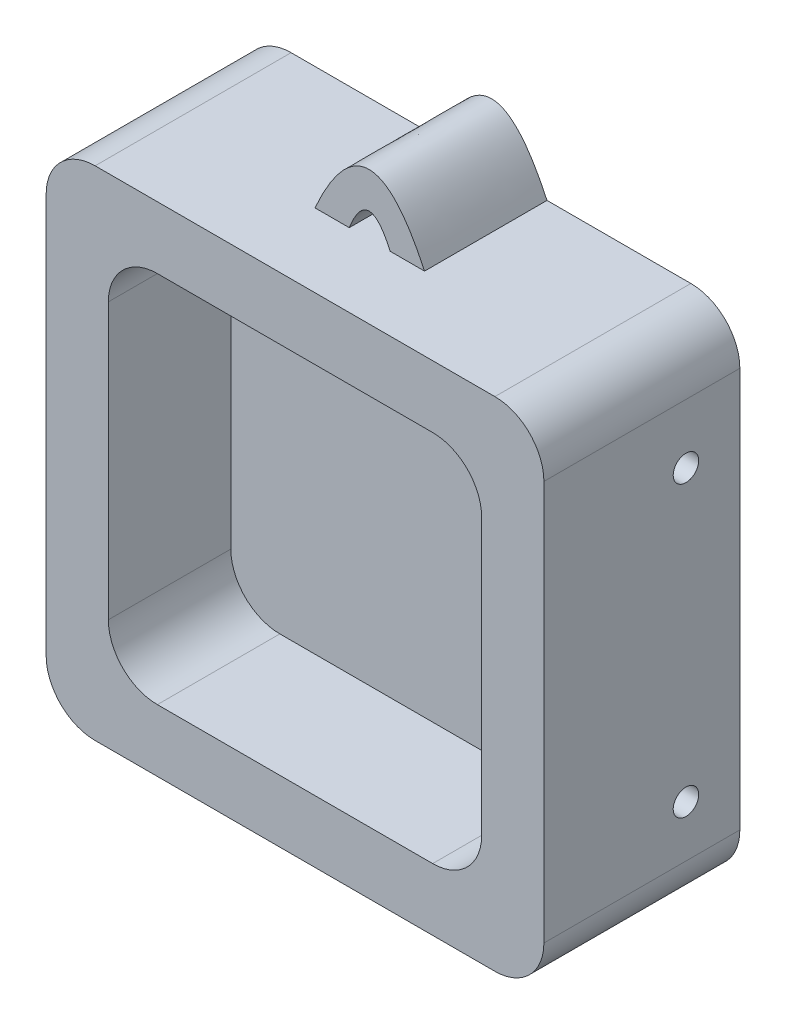
ISO-10303-21;
HEADER;
FILE_DESCRIPTION(('STEP AP214'),'2;1');
FILE_NAME('part.step','',(''),(''),'','','');
FILE_SCHEMA(('AUTOMOTIVE_DESIGN { 1 0 10303 214 1 1 1 1 }'));
ENDSEC;
DATA;
#1=APPLICATION_CONTEXT('core data for automotive mechanical design processes');
#2=APPLICATION_PROTOCOL_DEFINITION('international standard','automotive_design',2000,#1);
#3=PRODUCT_CONTEXT('',#1,'mechanical');
#4=PRODUCT('Part','Part','',(#3));
#5=PRODUCT_RELATED_PRODUCT_CATEGORY('part','',(#4));
#6=PRODUCT_DEFINITION_FORMATION('','',#4);
#7=PRODUCT_DEFINITION_CONTEXT('part definition',#1,'design');
#8=PRODUCT_DEFINITION('design','',#6,#7);
#9=PRODUCT_DEFINITION_SHAPE('','',#8);
#10=(LENGTH_UNIT() NAMED_UNIT(*) SI_UNIT(.MILLI.,.METRE.));
#11=(NAMED_UNIT(*) PLANE_ANGLE_UNIT() SI_UNIT($,.RADIAN.));
#12=(NAMED_UNIT(*) SI_UNIT($,.STERADIAN.) SOLID_ANGLE_UNIT());
#13=UNCERTAINTY_MEASURE_WITH_UNIT(LENGTH_MEASURE(1.E-05),#10,'distance_accuracy_value','');
#14=(GEOMETRIC_REPRESENTATION_CONTEXT(3) GLOBAL_UNCERTAINTY_ASSIGNED_CONTEXT((#13)) GLOBAL_UNIT_ASSIGNED_CONTEXT((#10,
#11,#12)) REPRESENTATION_CONTEXT('',''));
#15=CARTESIAN_POINT('',(0.,0.,0.));
#16=DIRECTION('',(0.,0.,1.));
#17=DIRECTION('',(1.,0.,0.));
#18=AXIS2_PLACEMENT_3D('',#15,#16,#17);
#19=CARTESIAN_POINT('',(0.,101.6,40.));
#20=DIRECTION('',(0.,1.,0.));
#21=DIRECTION('',(0.,0.,1.));
#22=AXIS2_PLACEMENT_3D('',#19,#20,#21);
#23=PLANE('',#22);
#24=DIRECTION('',(1.,0.,0.));
#25=VECTOR('',#24,1.);
#26=CARTESIAN_POINT('',(0.,101.6,40.));
#27=LINE('',#26,#25);
#28=CARTESIAN_POINT('',(9.99999999999998,101.6,40.));
#29=VERTEX_POINT('',#28);
#30=CARTESIAN_POINT('',(91.6,101.6,40.));
#31=VERTEX_POINT('',#30);
#32=EDGE_CURVE('E245',#29,#31,#27,.T.);
#33=ORIENTED_EDGE('',*,*,#32,.T.);
#34=DIRECTION('',(0.,0.,-1.));
#35=VECTOR('',#34,1.);
#36=CARTESIAN_POINT('',(91.6,101.6,0.));
#37=LINE('',#36,#35);
#38=CARTESIAN_POINT('',(91.6,101.6,0.));
#39=VERTEX_POINT('',#38);
#40=EDGE_CURVE('E319',#31,#39,#37,.T.);
#41=ORIENTED_EDGE('',*,*,#40,.T.);
#42=DIRECTION('',(1.,0.,0.));
#43=VECTOR('',#42,1.);
#44=CARTESIAN_POINT('',(0.,101.6,0.));
#45=LINE('',#44,#43);
#46=CARTESIAN_POINT('',(62.2378123331958,101.6,0.));
#47=VERTEX_POINT('',#46);
#48=EDGE_CURVE('E274',#47,#39,#45,.T.);
#49=ORIENTED_EDGE('',*,*,#48,.F.);
#50=DIRECTION('',(0.,0.,-1.));
#51=VECTOR('',#50,1.);
#52=CARTESIAN_POINT('',(62.2378123331958,101.6,25.));
#53=LINE('',#52,#51);
#54=CARTESIAN_POINT('',(62.2378123331958,101.6,25.));
#55=VERTEX_POINT('',#54);
#56=EDGE_CURVE('E221',#55,#47,#53,.T.);
#57=ORIENTED_EDGE('',*,*,#56,.F.);
#58=DIRECTION('',(1.,0.,0.));
#59=VECTOR('',#58,1.);
#60=CARTESIAN_POINT('',(0.,101.6,25.));
#61=LINE('',#60,#59);
#62=CARTESIAN_POINT('',(55.2378123331958,101.6,25.));
#63=VERTEX_POINT('',#62);
#64=EDGE_CURVE('E197',#63,#55,#61,.T.);
#65=ORIENTED_EDGE('',*,*,#64,.F.);
#66=DIRECTION('',(0.,0.,-1.));
#67=VECTOR('',#66,1.);
#68=CARTESIAN_POINT('',(55.2378123331958,101.6,25.));
#69=LINE('',#68,#67);
#70=CARTESIAN_POINT('',(55.2378123331958,101.6,0.));
#71=VERTEX_POINT('',#70);
#72=EDGE_CURVE('E193',#63,#71,#69,.T.);
#73=ORIENTED_EDGE('',*,*,#72,.T.);
#74=CARTESIAN_POINT('',(46.8729318237276,101.6,0.));
#75=VERTEX_POINT('',#74);
#76=EDGE_CURVE('E213',#75,#71,#45,.T.);
#77=ORIENTED_EDGE('',*,*,#76,.F.);
#78=DIRECTION('',(0.,0.,-1.));
#79=VECTOR('',#78,1.);
#80=CARTESIAN_POINT('',(46.8729318237276,101.6,25.));
#81=LINE('',#80,#79);
#82=CARTESIAN_POINT('',(46.8729318237276,101.6,25.));
#83=VERTEX_POINT('',#82);
#84=EDGE_CURVE('E190',#83,#75,#81,.T.);
#85=ORIENTED_EDGE('',*,*,#84,.F.);
#86=CARTESIAN_POINT('',(39.8729318237276,101.6,25.));
#87=VERTEX_POINT('',#86);
#88=EDGE_CURVE('E198',#87,#83,#61,.T.);
#89=ORIENTED_EDGE('',*,*,#88,.F.);
#90=DIRECTION('',(0.,0.,-1.));
#91=VECTOR('',#90,1.);
#92=CARTESIAN_POINT('',(39.8729318237276,101.6,25.));
#93=LINE('',#92,#91);
#94=CARTESIAN_POINT('',(39.8729318237276,101.6,0.));
#95=VERTEX_POINT('',#94);
#96=EDGE_CURVE('E424',#87,#95,#93,.T.);
#97=ORIENTED_EDGE('',*,*,#96,.T.);
#98=CARTESIAN_POINT('',(9.99999999999998,101.6,0.));
#99=VERTEX_POINT('',#98);
#100=EDGE_CURVE('E275',#99,#95,#45,.T.);
#101=ORIENTED_EDGE('',*,*,#100,.F.);
#102=DIRECTION('',(0.,0.,-1.));
#103=VECTOR('',#102,1.);
#104=CARTESIAN_POINT('',(9.99999999999998,101.6,40.));
#105=LINE('',#104,#103);
#106=EDGE_CURVE('E286',#99,#29,#105,.F.);
#107=ORIENTED_EDGE('',*,*,#106,.T.);
#108=EDGE_LOOP('',(#33,#41,#49,#57,#65,#73,#77,#85,#89,#97,#101,#107));
#109=FACE_BOUND('',#108,.T.);
#110=ADVANCED_FACE('F49',(#109),#23,.T.);
#111=CARTESIAN_POINT('',(0.,88.9,40.));
#112=DIRECTION('',(0.,1.,0.));
#113=DIRECTION('',(0.,0.,1.));
#114=AXIS2_PLACEMENT_3D('',#111,#112,#113);
#115=PLANE('',#114);
#116=DIRECTION('',(1.,0.,0.));
#117=VECTOR('',#116,1.);
#118=CARTESIAN_POINT('',(0.,88.9,15.));
#119=LINE('',#118,#117);
#120=CARTESIAN_POINT('',(22.7,88.9,15.));
#121=VERTEX_POINT('',#120);
#122=CARTESIAN_POINT('',(78.9,88.9,15.));
#123=VERTEX_POINT('',#122);
#124=EDGE_CURVE('E219',#121,#123,#119,.T.);
#125=ORIENTED_EDGE('',*,*,#124,.T.);
#126=DIRECTION('',(0.,0.,-1.));
#127=VECTOR('',#126,1.);
#128=CARTESIAN_POINT('',(78.9,88.9,40.));
#129=LINE('',#128,#127);
#130=CARTESIAN_POINT('',(78.9,88.9,40.));
#131=VERTEX_POINT('',#130);
#132=EDGE_CURVE('E352',#123,#131,#129,.F.);
#133=ORIENTED_EDGE('',*,*,#132,.T.);
#134=DIRECTION('',(1.,0.,0.));
#135=VECTOR('',#134,1.);
#136=CARTESIAN_POINT('',(0.,88.9,40.));
#137=LINE('',#136,#135);
#138=CARTESIAN_POINT('',(22.7,88.9,40.));
#139=VERTEX_POINT('',#138);
#140=EDGE_CURVE('E251',#139,#131,#137,.T.);
#141=ORIENTED_EDGE('',*,*,#140,.F.);
#142=DIRECTION('',(0.,0.,-1.));
#143=VECTOR('',#142,1.);
#144=CARTESIAN_POINT('',(22.7,88.9,40.));
#145=LINE('',#144,#143);
#146=EDGE_CURVE('E332',#139,#121,#145,.T.);
#147=ORIENTED_EDGE('',*,*,#146,.T.);
#148=EDGE_LOOP('',(#125,#133,#141,#147));
#149=FACE_BOUND('',#148,.T.);
#150=ADVANCED_FACE('F483',(#149),#115,.F.);
#151=CARTESIAN_POINT('',(88.9,0.,40.));
#152=DIRECTION('',(1.,0.,0.));
#153=DIRECTION('',(0.,1.,0.));
#154=AXIS2_PLACEMENT_3D('',#151,#152,#153);
#155=PLANE('',#154);
#156=DIRECTION('',(0.,-1.,0.));
#157=VECTOR('',#156,1.);
#158=CARTESIAN_POINT('',(88.9,0.,15.));
#159=LINE('',#158,#157);
#160=CARTESIAN_POINT('',(88.9,78.9,15.));
#161=VERTEX_POINT('',#160);
#162=CARTESIAN_POINT('',(88.9,22.7,15.));
#163=VERTEX_POINT('',#162);
#164=EDGE_CURVE('E215',#161,#163,#159,.T.);
#165=ORIENTED_EDGE('',*,*,#164,.T.);
#166=DIRECTION('',(0.,0.,-1.));
#167=VECTOR('',#166,1.);
#168=CARTESIAN_POINT('',(88.9,22.7,40.));
#169=LINE('',#168,#167);
#170=CARTESIAN_POINT('',(88.9,22.7,40.));
#171=VERTEX_POINT('',#170);
#172=EDGE_CURVE('E58',#163,#171,#169,.F.);
#173=ORIENTED_EDGE('',*,*,#172,.T.);
#174=DIRECTION('',(0.,-1.,0.));
#175=VECTOR('',#174,1.);
#176=CARTESIAN_POINT('',(88.9,0.,40.));
#177=LINE('',#176,#175);
#178=CARTESIAN_POINT('',(88.9,78.9,40.));
#179=VERTEX_POINT('',#178);
#180=EDGE_CURVE('E255',#179,#171,#177,.T.);
#181=ORIENTED_EDGE('',*,*,#180,.F.);
#182=DIRECTION('',(0.,0.,-1.));
#183=VECTOR('',#182,1.);
#184=CARTESIAN_POINT('',(88.9,78.9,15.));
#185=LINE('',#184,#183);
#186=EDGE_CURVE('E345',#179,#161,#185,.T.);
#187=ORIENTED_EDGE('',*,*,#186,.T.);
#188=EDGE_LOOP('',(#165,#173,#181,#187));
#189=FACE_BOUND('',#188,.T.);
#190=ADVANCED_FACE('F479',(#189),#155,.F.);
#191=CARTESIAN_POINT('',(0.,12.7,40.));
#192=DIRECTION('',(0.,1.,0.));
#193=DIRECTION('',(0.,0.,1.));
#194=AXIS2_PLACEMENT_3D('',#191,#192,#193);
#195=PLANE('',#194);
#196=DIRECTION('',(1.,0.,0.));
#197=VECTOR('',#196,1.);
#198=CARTESIAN_POINT('',(0.,12.7,40.));
#199=LINE('',#198,#197);
#200=CARTESIAN_POINT('',(22.7,12.7,40.));
#201=VERTEX_POINT('',#200);
#202=CARTESIAN_POINT('',(78.9,12.7,40.));
#203=VERTEX_POINT('',#202);
#204=EDGE_CURVE('E258',#201,#203,#199,.T.);
#205=ORIENTED_EDGE('',*,*,#204,.T.);
#206=DIRECTION('',(0.,0.,-1.));
#207=VECTOR('',#206,1.);
#208=CARTESIAN_POINT('',(78.9,12.7,40.));
#209=LINE('',#208,#207);
#210=CARTESIAN_POINT('',(78.9,12.7,15.));
#211=VERTEX_POINT('',#210);
#212=EDGE_CURVE('E371',#203,#211,#209,.T.);
#213=ORIENTED_EDGE('',*,*,#212,.T.);
#214=DIRECTION('',(1.,0.,0.));
#215=VECTOR('',#214,1.);
#216=CARTESIAN_POINT('',(0.,12.7,15.));
#217=LINE('',#216,#215);
#218=CARTESIAN_POINT('',(22.7,12.7,15.));
#219=VERTEX_POINT('',#218);
#220=EDGE_CURVE('E232',#219,#211,#217,.T.);
#221=ORIENTED_EDGE('',*,*,#220,.F.);
#222=DIRECTION('',(0.,0.,-1.));
#223=VECTOR('',#222,1.);
#224=CARTESIAN_POINT('',(22.7,12.7,40.));
#225=LINE('',#224,#223);
#226=EDGE_CURVE('E365',#219,#201,#225,.F.);
#227=ORIENTED_EDGE('',*,*,#226,.T.);
#228=EDGE_LOOP('',(#205,#213,#221,#227));
#229=FACE_BOUND('',#228,.T.);
#230=ADVANCED_FACE('F476',(#229),#195,.T.);
#231=CARTESIAN_POINT('',(0.,0.,40.));
#232=DIRECTION('',(0.,1.,0.));
#233=DIRECTION('',(0.,0.,1.));
#234=AXIS2_PLACEMENT_3D('',#231,#232,#233);
#235=PLANE('',#234);
#236=DIRECTION('',(1.,0.,0.));
#237=VECTOR('',#236,1.);
#238=CARTESIAN_POINT('',(0.,0.,0.));
#239=LINE('',#238,#237);
#240=CARTESIAN_POINT('',(10.,0.,0.));
#241=VERTEX_POINT('',#240);
#242=CARTESIAN_POINT('',(91.6,0.,0.));
#243=VERTEX_POINT('',#242);
#244=EDGE_CURVE('E235',#241,#243,#239,.T.);
#245=ORIENTED_EDGE('',*,*,#244,.T.);
#246=DIRECTION('',(0.,0.,-1.));
#247=VECTOR('',#246,1.);
#248=CARTESIAN_POINT('',(91.6,0.,40.));
#249=LINE('',#248,#247);
#250=CARTESIAN_POINT('',(91.6,0.,40.));
#251=VERTEX_POINT('',#250);
#252=EDGE_CURVE('E313',#243,#251,#249,.F.);
#253=ORIENTED_EDGE('',*,*,#252,.T.);
#254=DIRECTION('',(1.,0.,0.));
#255=VECTOR('',#254,1.);
#256=CARTESIAN_POINT('',(0.,0.,40.));
#257=LINE('',#256,#255);
#258=CARTESIAN_POINT('',(10.,0.,40.));
#259=VERTEX_POINT('',#258);
#260=EDGE_CURVE('E236',#259,#251,#257,.T.);
#261=ORIENTED_EDGE('',*,*,#260,.F.);
#262=DIRECTION('',(0.,0.,-1.));
#263=VECTOR('',#262,1.);
#264=CARTESIAN_POINT('',(10.,0.,0.));
#265=LINE('',#264,#263);
#266=EDGE_CURVE('E293',#259,#241,#265,.T.);
#267=ORIENTED_EDGE('',*,*,#266,.T.);
#268=EDGE_LOOP('',(#245,#253,#261,#267));
#269=FACE_BOUND('',#268,.T.);
#270=ADVANCED_FACE('F407',(#269),#235,.F.);
#271=CARTESIAN_POINT('',(101.6,0.,40.));
#272=DIRECTION('',(-1.,0.,0.));
#273=DIRECTION('',(0.,0.,1.));
#274=AXIS2_PLACEMENT_3D('',#271,#272,#273);
#275=PLANE('',#274);
#276=CARTESIAN_POINT('',(101.6,79.4963471898506,11.));
#277=DIRECTION('',(1.,0.,0.));
#278=DIRECTION('',(0.,0.,-1.));
#279=AXIS2_PLACEMENT_3D('',#276,#277,#278);
#280=CIRCLE('',#279,2.6);
#281=CARTESIAN_POINT('',(101.6,79.4963471898506,8.4));
#282=VERTEX_POINT('',#281);
#283=EDGE_CURVE('E658',#282,#282,#280,.T.);
#284=ORIENTED_EDGE('',*,*,#283,.F.);
#285=EDGE_LOOP('',(#284));
#286=FACE_BOUND('',#285,.T.);
#287=CARTESIAN_POINT('',(101.6,20.4780792381224,11.));
#288=DIRECTION('',(1.,0.,0.));
#289=DIRECTION('',(0.,0.,-1.));
#290=AXIS2_PLACEMENT_3D('',#287,#288,#289);
#291=CIRCLE('',#290,2.6);
#292=CARTESIAN_POINT('',(101.6,20.4780792381224,8.4));
#293=VERTEX_POINT('',#292);
#294=EDGE_CURVE('E660',#293,#293,#291,.T.);
#295=ORIENTED_EDGE('',*,*,#294,.F.);
#296=EDGE_LOOP('',(#295));
#297=FACE_BOUND('',#296,.T.);
#298=DIRECTION('',(0.,1.,0.));
#299=VECTOR('',#298,1.);
#300=CARTESIAN_POINT('',(101.6,0.,0.));
#301=LINE('',#300,#299);
#302=CARTESIAN_POINT('',(101.6,10.,0.));
#303=VERTEX_POINT('',#302);
#304=CARTESIAN_POINT('',(101.6,91.6,0.));
#305=VERTEX_POINT('',#304);
#306=EDGE_CURVE('E270',#303,#305,#301,.T.);
#307=ORIENTED_EDGE('',*,*,#306,.T.);
#308=DIRECTION('',(0.,0.,-1.));
#309=VECTOR('',#308,1.);
#310=CARTESIAN_POINT('',(101.6,91.6,40.));
#311=LINE('',#310,#309);
#312=CARTESIAN_POINT('',(101.6,91.6,40.));
#313=VERTEX_POINT('',#312);
#314=EDGE_CURVE('E326',#305,#313,#311,.F.);
#315=ORIENTED_EDGE('',*,*,#314,.T.);
#316=DIRECTION('',(0.,1.,0.));
#317=VECTOR('',#316,1.);
#318=CARTESIAN_POINT('',(101.6,0.,40.));
#319=LINE('',#318,#317);
#320=CARTESIAN_POINT('',(101.6,10.,40.));
#321=VERTEX_POINT('',#320);
#322=EDGE_CURVE('E240',#321,#313,#319,.T.);
#323=ORIENTED_EDGE('',*,*,#322,.F.);
#324=DIRECTION('',(0.,0.,-1.));
#325=VECTOR('',#324,1.);
#326=CARTESIAN_POINT('',(101.6,10.,40.));
#327=LINE('',#326,#325);
#328=EDGE_CURVE('E306',#321,#303,#327,.T.);
#329=ORIENTED_EDGE('',*,*,#328,.T.);
#330=EDGE_LOOP('',(#307,#315,#323,#329));
#331=FACE_BOUND('',#330,.T.);
#332=ADVANCED_FACE('F395',(#286,#297,#331),#275,.F.);
#333=CARTESIAN_POINT('',(0.,0.,40.));
#334=DIRECTION('',(-1.,0.,0.));
#335=DIRECTION('',(0.,-1.,0.));
#336=AXIS2_PLACEMENT_3D('',#333,#334,#335);
#337=PLANE('',#336);
#338=CARTESIAN_POINT('',(0.,79.4963471898506,11.));
#339=DIRECTION('',(1.,0.,0.));
#340=DIRECTION('',(0.,0.,-1.));
#341=AXIS2_PLACEMENT_3D('',#338,#339,#340);
#342=CIRCLE('',#341,2.6);
#343=CARTESIAN_POINT('',(0.,79.4963471898506,8.4));
#344=VERTEX_POINT('',#343);
#345=EDGE_CURVE('E443',#344,#344,#342,.T.);
#346=ORIENTED_EDGE('',*,*,#345,.T.);
#347=EDGE_LOOP('',(#346));
#348=FACE_BOUND('',#347,.T.);
#349=CARTESIAN_POINT('',(0.,20.4780792381224,11.));
#350=DIRECTION('',(1.,0.,0.));
#351=DIRECTION('',(0.,0.,-1.));
#352=AXIS2_PLACEMENT_3D('',#349,#350,#351);
#353=CIRCLE('',#352,2.6);
#354=CARTESIAN_POINT('',(0.,20.4780792381224,8.4));
#355=VERTEX_POINT('',#354);
#356=EDGE_CURVE('E666',#355,#355,#353,.T.);
#357=ORIENTED_EDGE('',*,*,#356,.T.);
#358=EDGE_LOOP('',(#357));
#359=FACE_BOUND('',#358,.T.);
#360=DIRECTION('',(0.,1.,0.));
#361=VECTOR('',#360,1.);
#362=CARTESIAN_POINT('',(0.,0.,0.));
#363=LINE('',#362,#361);
#364=CARTESIAN_POINT('',(0.,10.,0.));
#365=VERTEX_POINT('',#364);
#366=CARTESIAN_POINT('',(0.,91.6,0.));
#367=VERTEX_POINT('',#366);
#368=EDGE_CURVE('E241',#365,#367,#363,.T.);
#369=ORIENTED_EDGE('',*,*,#368,.F.);
#370=DIRECTION('',(0.,0.,-1.));
#371=VECTOR('',#370,1.);
#372=CARTESIAN_POINT('',(0.,10.,40.));
#373=LINE('',#372,#371);
#374=CARTESIAN_POINT('',(0.,10.,40.));
#375=VERTEX_POINT('',#374);
#376=EDGE_CURVE('E300',#365,#375,#373,.F.);
#377=ORIENTED_EDGE('',*,*,#376,.T.);
#378=DIRECTION('',(0.,1.,0.));
#379=VECTOR('',#378,1.);
#380=CARTESIAN_POINT('',(0.,0.,40.));
#381=LINE('',#380,#379);
#382=CARTESIAN_POINT('',(0.,91.6,40.));
#383=VERTEX_POINT('',#382);
#384=EDGE_CURVE('E248',#375,#383,#381,.T.);
#385=ORIENTED_EDGE('',*,*,#384,.T.);
#386=DIRECTION('',(0.,0.,-1.));
#387=VECTOR('',#386,1.);
#388=CARTESIAN_POINT('',(0.,91.6,40.));
#389=LINE('',#388,#387);
#390=EDGE_CURVE('E266',#383,#367,#389,.T.);
#391=ORIENTED_EDGE('',*,*,#390,.T.);
#392=EDGE_LOOP('',(#369,#377,#385,#391));
#393=FACE_BOUND('',#392,.T.);
#394=ADVANCED_FACE('F416',(#348,#359,#393),#337,.T.);
#395=CARTESIAN_POINT('',(12.7,0.,40.));
#396=DIRECTION('',(1.,0.,0.));
#397=DIRECTION('',(0.,1.,0.));
#398=AXIS2_PLACEMENT_3D('',#395,#396,#397);
#399=PLANE('',#398);
#400=DIRECTION('',(0.,-1.,0.));
#401=VECTOR('',#400,1.);
#402=CARTESIAN_POINT('',(12.7,0.,40.));
#403=LINE('',#402,#401);
#404=CARTESIAN_POINT('',(12.7,78.9,40.));
#405=VERTEX_POINT('',#404);
#406=CARTESIAN_POINT('',(12.7,22.7,40.));
#407=VERTEX_POINT('',#406);
#408=EDGE_CURVE('E262',#405,#407,#403,.T.);
#409=ORIENTED_EDGE('',*,*,#408,.T.);
#410=DIRECTION('',(0.,0.,-1.));
#411=VECTOR('',#410,1.);
#412=CARTESIAN_POINT('',(12.7,22.7,15.));
#413=LINE('',#412,#411);
#414=CARTESIAN_POINT('',(12.7,22.7,15.));
#415=VERTEX_POINT('',#414);
#416=EDGE_CURVE('E358',#407,#415,#413,.T.);
#417=ORIENTED_EDGE('',*,*,#416,.T.);
#418=DIRECTION('',(0.,-1.,0.));
#419=VECTOR('',#418,1.);
#420=CARTESIAN_POINT('',(12.7,0.,15.));
#421=LINE('',#420,#419);
#422=CARTESIAN_POINT('',(12.7,78.9,15.));
#423=VERTEX_POINT('',#422);
#424=EDGE_CURVE('E228',#423,#415,#421,.T.);
#425=ORIENTED_EDGE('',*,*,#424,.F.);
#426=DIRECTION('',(0.,0.,-1.));
#427=VECTOR('',#426,1.);
#428=CARTESIAN_POINT('',(12.7,78.9,40.));
#429=LINE('',#428,#427);
#430=EDGE_CURVE('E339',#423,#405,#429,.F.);
#431=ORIENTED_EDGE('',*,*,#430,.T.);
#432=EDGE_LOOP('',(#409,#417,#425,#431));
#433=FACE_BOUND('',#432,.T.);
#434=ADVANCED_FACE('F469',(#433),#399,.T.);
#435=CARTESIAN_POINT('',(0.,0.,40.));
#436=DIRECTION('',(0.,0.,1.));
#437=DIRECTION('',(1.,0.,0.));
#438=AXIS2_PLACEMENT_3D('',#435,#436,#437);
#439=PLANE('',#438);
#440=ORIENTED_EDGE('',*,*,#322,.T.);
#441=CARTESIAN_POINT('',(91.6,91.6,40.));
#442=DIRECTION('',(0.,0.,1.));
#443=DIRECTION('',(1.,0.,0.));
#444=AXIS2_PLACEMENT_3D('',#441,#442,#443);
#445=CIRCLE('',#444,10.);
#446=EDGE_CURVE('E329',#313,#31,#445,.T.);
#447=ORIENTED_EDGE('',*,*,#446,.T.);
#448=ORIENTED_EDGE('',*,*,#32,.F.);
#449=CARTESIAN_POINT('',(9.99999999999998,91.6,40.));
#450=DIRECTION('',(0.,0.,1.));
#451=DIRECTION('',(1.,0.,0.));
#452=AXIS2_PLACEMENT_3D('',#449,#450,#451);
#453=CIRCLE('',#452,10.);
#454=EDGE_CURVE('E289',#29,#383,#453,.T.);
#455=ORIENTED_EDGE('',*,*,#454,.T.);
#456=ORIENTED_EDGE('',*,*,#384,.F.);
#457=CARTESIAN_POINT('',(10.,10.,40.));
#458=DIRECTION('',(0.,0.,1.));
#459=DIRECTION('',(1.,0.,0.));
#460=AXIS2_PLACEMENT_3D('',#457,#458,#459);
#461=CIRCLE('',#460,10.);
#462=EDGE_CURVE('E303',#375,#259,#461,.T.);
#463=ORIENTED_EDGE('',*,*,#462,.T.);
#464=ORIENTED_EDGE('',*,*,#260,.T.);
#465=CARTESIAN_POINT('',(91.6,10.,40.));
#466=DIRECTION('',(0.,0.,1.));
#467=DIRECTION('',(1.,0.,0.));
#468=AXIS2_PLACEMENT_3D('',#465,#466,#467);
#469=CIRCLE('',#468,10.);
#470=EDGE_CURVE('E316',#251,#321,#469,.T.);
#471=ORIENTED_EDGE('',*,*,#470,.T.);
#472=EDGE_LOOP('',(#440,#447,#448,#455,#456,#463,#464,#471));
#473=FACE_BOUND('',#472,.T.);
#474=ORIENTED_EDGE('',*,*,#408,.F.);
#475=CARTESIAN_POINT('',(22.7,78.9,40.));
#476=DIRECTION('',(0.,0.,1.));
#477=DIRECTION('',(1.,0.,0.));
#478=AXIS2_PLACEMENT_3D('',#475,#476,#477);
#479=CIRCLE('',#478,10.);
#480=EDGE_CURVE('E342',#405,#139,#479,.F.);
#481=ORIENTED_EDGE('',*,*,#480,.T.);
#482=ORIENTED_EDGE('',*,*,#140,.T.);
#483=CARTESIAN_POINT('',(78.9,78.9,40.));
#484=DIRECTION('',(0.,0.,1.));
#485=DIRECTION('',(1.,0.,0.));
#486=AXIS2_PLACEMENT_3D('',#483,#484,#485);
#487=CIRCLE('',#486,10.);
#488=EDGE_CURVE('E355',#131,#179,#487,.F.);
#489=ORIENTED_EDGE('',*,*,#488,.T.);
#490=ORIENTED_EDGE('',*,*,#180,.T.);
#491=CARTESIAN_POINT('',(78.9,22.7,40.));
#492=DIRECTION('',(0.,0.,1.));
#493=DIRECTION('',(1.,0.,0.));
#494=AXIS2_PLACEMENT_3D('',#491,#492,#493);
#495=CIRCLE('',#494,10.);
#496=EDGE_CURVE('E11',#171,#203,#495,.F.);
#497=ORIENTED_EDGE('',*,*,#496,.T.);
#498=ORIENTED_EDGE('',*,*,#204,.F.);
#499=CARTESIAN_POINT('',(22.7,22.7,40.));
#500=DIRECTION('',(0.,0.,1.));
#501=DIRECTION('',(1.,0.,0.));
#502=AXIS2_PLACEMENT_3D('',#499,#500,#501);
#503=CIRCLE('',#502,10.);
#504=EDGE_CURVE('E368',#201,#407,#503,.F.);
#505=ORIENTED_EDGE('',*,*,#504,.T.);
#506=EDGE_LOOP('',(#474,#481,#482,#489,#490,#497,#498,#505));
#507=FACE_BOUND('',#506,.T.);
#508=ADVANCED_FACE('F398',(#473,#507),#439,.T.);
#509=CARTESIAN_POINT('',(0.,0.,0.));
#510=DIRECTION('',(0.,0.,1.));
#511=DIRECTION('',(1.,0.,0.));
#512=AXIS2_PLACEMENT_3D('',#509,#510,#511);
#513=PLANE('',#512);
#514=CARTESIAN_POINT('',(46.8729318237276,101.6,0.));
#515=CARTESIAN_POINT('',(50.7570229122555,111.505038694401,0.));
#516=CARTESIAN_POINT('',(55.2378123331958,101.6,0.));
#517=B_SPLINE_CURVE_WITH_KNOTS('',2,(#514,#515,#516),.UNSPECIFIED.,.F.,.F.,(3,3),(0.,1.),.UNSPECIFIED.);
#518=EDGE_CURVE('E436',#75,#71,#517,.T.);
#519=ORIENTED_EDGE('',*,*,#518,.F.);
#520=ORIENTED_EDGE('',*,*,#76,.T.);
#521=EDGE_LOOP('',(#519,#520));
#522=FACE_BOUND('',#521,.T.);
#523=ORIENTED_EDGE('',*,*,#48,.T.);
#524=CARTESIAN_POINT('',(91.6,91.6,0.));
#525=DIRECTION('',(0.,0.,1.));
#526=DIRECTION('',(1.,0.,0.));
#527=AXIS2_PLACEMENT_3D('',#524,#525,#526);
#528=CIRCLE('',#527,10.);
#529=EDGE_CURVE('E323',#39,#305,#528,.F.);
#530=ORIENTED_EDGE('',*,*,#529,.T.);
#531=ORIENTED_EDGE('',*,*,#306,.F.);
#532=CARTESIAN_POINT('',(91.6,10.,0.));
#533=DIRECTION('',(0.,0.,1.));
#534=DIRECTION('',(1.,0.,0.));
#535=AXIS2_PLACEMENT_3D('',#532,#533,#534);
#536=CIRCLE('',#535,10.);
#537=EDGE_CURVE('E310',#303,#243,#536,.F.);
#538=ORIENTED_EDGE('',*,*,#537,.T.);
#539=ORIENTED_EDGE('',*,*,#244,.F.);
#540=CARTESIAN_POINT('',(10.,10.,0.));
#541=DIRECTION('',(0.,0.,1.));
#542=DIRECTION('',(1.,0.,0.));
#543=AXIS2_PLACEMENT_3D('',#540,#541,#542);
#544=CIRCLE('',#543,10.);
#545=EDGE_CURVE('E297',#241,#365,#544,.F.);
#546=ORIENTED_EDGE('',*,*,#545,.T.);
#547=ORIENTED_EDGE('',*,*,#368,.T.);
#548=CARTESIAN_POINT('',(9.99999999999998,91.6,0.));
#549=DIRECTION('',(0.,0.,1.));
#550=DIRECTION('',(1.,0.,0.));
#551=AXIS2_PLACEMENT_3D('',#548,#549,#550);
#552=CIRCLE('',#551,10.);
#553=EDGE_CURVE('E283',#367,#99,#552,.F.);
#554=ORIENTED_EDGE('',*,*,#553,.T.);
#555=ORIENTED_EDGE('',*,*,#100,.T.);
#556=CARTESIAN_POINT('',(39.8729318237276,101.6,0.));
#557=CARTESIAN_POINT('',(50.7754485559075,126.225942052874,0.));
#558=CARTESIAN_POINT('',(62.2378123331958,101.6,0.));
#559=B_SPLINE_CURVE_WITH_KNOTS('',2,(#556,#557,#558),.UNSPECIFIED.,.F.,.F.,(3,3),(0.,1.),.UNSPECIFIED.);
#560=EDGE_CURVE('E208',#95,#47,#559,.T.);
#561=ORIENTED_EDGE('',*,*,#560,.T.);
#562=EDGE_LOOP('',(#523,#530,#531,#538,#539,#546,#547,#554,#555,#561));
#563=FACE_BOUND('',#562,.T.);
#564=ADVANCED_FACE('F382',(#522,#563),#513,.F.);
#565=CARTESIAN_POINT('',(0.,0.,15.));
#566=DIRECTION('',(0.,0.,1.));
#567=DIRECTION('',(1.,0.,0.));
#568=AXIS2_PLACEMENT_3D('',#565,#566,#567);
#569=PLANE('',#568);
#570=ORIENTED_EDGE('',*,*,#220,.T.);
#571=CARTESIAN_POINT('',(78.9,22.7,15.));
#572=DIRECTION('',(0.,0.,1.));
#573=DIRECTION('',(1.,0.,0.));
#574=AXIS2_PLACEMENT_3D('',#571,#572,#573);
#575=CIRCLE('',#574,10.);
#576=EDGE_CURVE('E72',#211,#163,#575,.T.);
#577=ORIENTED_EDGE('',*,*,#576,.T.);
#578=ORIENTED_EDGE('',*,*,#164,.F.);
#579=CARTESIAN_POINT('',(78.9,78.9,15.));
#580=DIRECTION('',(0.,0.,1.));
#581=DIRECTION('',(1.,0.,0.));
#582=AXIS2_PLACEMENT_3D('',#579,#580,#581);
#583=CIRCLE('',#582,10.);
#584=EDGE_CURVE('E349',#161,#123,#583,.T.);
#585=ORIENTED_EDGE('',*,*,#584,.T.);
#586=ORIENTED_EDGE('',*,*,#124,.F.);
#587=CARTESIAN_POINT('',(22.7,78.9,15.));
#588=DIRECTION('',(0.,0.,1.));
#589=DIRECTION('',(1.,0.,0.));
#590=AXIS2_PLACEMENT_3D('',#587,#588,#589);
#591=CIRCLE('',#590,10.);
#592=EDGE_CURVE('E336',#121,#423,#591,.T.);
#593=ORIENTED_EDGE('',*,*,#592,.T.);
#594=ORIENTED_EDGE('',*,*,#424,.T.);
#595=CARTESIAN_POINT('',(22.7,22.7,15.));
#596=DIRECTION('',(0.,0.,1.));
#597=DIRECTION('',(1.,0.,0.));
#598=AXIS2_PLACEMENT_3D('',#595,#596,#597);
#599=CIRCLE('',#598,10.);
#600=EDGE_CURVE('E362',#415,#219,#599,.T.);
#601=ORIENTED_EDGE('',*,*,#600,.T.);
#602=EDGE_LOOP('',(#570,#577,#578,#585,#586,#593,#594,#601));
#603=FACE_BOUND('',#602,.T.);
#604=ADVANCED_FACE('F464',(#603),#569,.T.);
#605=CARTESIAN_POINT('',(46.8729318237276,101.6,25.));
#606=CARTESIAN_POINT('',(50.7570229122555,111.505038694401,25.));
#607=CARTESIAN_POINT('',(55.2378123331958,101.6,25.));
#608=B_SPLINE_CURVE_WITH_KNOTS('',2,(#605,#606,#607),.UNSPECIFIED.,.F.,.F.,(3,3),(0.,1.),.UNSPECIFIED.);
#609=DIRECTION('',(0.,0.,-1.));
#610=VECTOR('',#609,1.);
#611=SURFACE_OF_LINEAR_EXTRUSION('',#608,#610);
#612=ORIENTED_EDGE('',*,*,#518,.T.);
#613=ORIENTED_EDGE('',*,*,#72,.F.);
#614=EDGE_CURVE('E186',#83,#63,#608,.T.);
#615=ORIENTED_EDGE('',*,*,#614,.F.);
#616=ORIENTED_EDGE('',*,*,#84,.T.);
#617=EDGE_LOOP('',(#612,#613,#615,#616));
#618=FACE_BOUND('',#617,.T.);
#619=ADVANCED_FACE('F188',(#618),#611,.F.);
#620=CARTESIAN_POINT('',(39.8729318237276,101.6,25.));
#621=CARTESIAN_POINT('',(50.7754485559075,126.225942052874,25.));
#622=CARTESIAN_POINT('',(62.2378123331958,101.6,25.));
#623=B_SPLINE_CURVE_WITH_KNOTS('',2,(#620,#621,#622),.UNSPECIFIED.,.F.,.F.,(3,3),(0.,1.),.UNSPECIFIED.);
#624=DIRECTION('',(0.,0.,-1.));
#625=VECTOR('',#624,1.);
#626=SURFACE_OF_LINEAR_EXTRUSION('',#623,#625);
#627=ORIENTED_EDGE('',*,*,#560,.F.);
#628=ORIENTED_EDGE('',*,*,#96,.F.);
#629=EDGE_CURVE('E204',#87,#55,#623,.T.);
#630=ORIENTED_EDGE('',*,*,#629,.T.);
#631=ORIENTED_EDGE('',*,*,#56,.T.);
#632=EDGE_LOOP('',(#627,#628,#630,#631));
#633=FACE_BOUND('',#632,.T.);
#634=ADVANCED_FACE('F457',(#633),#626,.T.);
#635=CARTESIAN_POINT('',(0.,0.,25.));
#636=DIRECTION('',(0.,0.,1.));
#637=DIRECTION('',(1.,0.,0.));
#638=AXIS2_PLACEMENT_3D('',#635,#636,#637);
#639=PLANE('',#638);
#640=ORIENTED_EDGE('',*,*,#88,.T.);
#641=ORIENTED_EDGE('',*,*,#614,.T.);
#642=ORIENTED_EDGE('',*,*,#64,.T.);
#643=ORIENTED_EDGE('',*,*,#629,.F.);
#644=EDGE_LOOP('',(#640,#641,#642,#643));
#645=FACE_BOUND('',#644,.T.);
#646=ADVANCED_FACE('F202',(#645),#639,.T.);
#647=CARTESIAN_POINT('',(9.99999999999998,91.6,40.));
#648=DIRECTION('',(0.,0.,-1.));
#649=DIRECTION('',(-1.,0.,0.));
#650=AXIS2_PLACEMENT_3D('',#647,#648,#649);
#651=CYLINDRICAL_SURFACE('',#650,10.);
#652=ORIENTED_EDGE('',*,*,#454,.F.);
#653=ORIENTED_EDGE('',*,*,#106,.F.);
#654=ORIENTED_EDGE('',*,*,#553,.F.);
#655=ORIENTED_EDGE('',*,*,#390,.F.);
#656=EDGE_LOOP('',(#652,#653,#654,#655));
#657=FACE_BOUND('',#656,.T.);
#658=ADVANCED_FACE('F421',(#657),#651,.T.);
#659=CARTESIAN_POINT('',(10.,10.,40.));
#660=DIRECTION('',(0.,0.,1.));
#661=DIRECTION('',(1.,0.,0.));
#662=AXIS2_PLACEMENT_3D('',#659,#660,#661);
#663=CYLINDRICAL_SURFACE('',#662,10.);
#664=ORIENTED_EDGE('',*,*,#462,.F.);
#665=ORIENTED_EDGE('',*,*,#376,.F.);
#666=ORIENTED_EDGE('',*,*,#545,.F.);
#667=ORIENTED_EDGE('',*,*,#266,.F.);
#668=EDGE_LOOP('',(#664,#665,#666,#667));
#669=FACE_BOUND('',#668,.T.);
#670=ADVANCED_FACE('F411',(#669),#663,.T.);
#671=CARTESIAN_POINT('',(91.6,10.,40.));
#672=DIRECTION('',(0.,0.,-1.));
#673=DIRECTION('',(-1.,0.,0.));
#674=AXIS2_PLACEMENT_3D('',#671,#672,#673);
#675=CYLINDRICAL_SURFACE('',#674,10.);
#676=ORIENTED_EDGE('',*,*,#470,.F.);
#677=ORIENTED_EDGE('',*,*,#252,.F.);
#678=ORIENTED_EDGE('',*,*,#537,.F.);
#679=ORIENTED_EDGE('',*,*,#328,.F.);
#680=EDGE_LOOP('',(#676,#677,#678,#679));
#681=FACE_BOUND('',#680,.T.);
#682=ADVANCED_FACE('F404',(#681),#675,.T.);
#683=CARTESIAN_POINT('',(91.6,91.6,40.));
#684=DIRECTION('',(0.,0.,1.));
#685=DIRECTION('',(1.,0.,0.));
#686=AXIS2_PLACEMENT_3D('',#683,#684,#685);
#687=CYLINDRICAL_SURFACE('',#686,10.);
#688=ORIENTED_EDGE('',*,*,#446,.F.);
#689=ORIENTED_EDGE('',*,*,#314,.F.);
#690=ORIENTED_EDGE('',*,*,#529,.F.);
#691=ORIENTED_EDGE('',*,*,#40,.F.);
#692=EDGE_LOOP('',(#688,#689,#690,#691));
#693=FACE_BOUND('',#692,.T.);
#694=ADVANCED_FACE('F391',(#693),#687,.T.);
#695=CARTESIAN_POINT('',(0.,20.4780792381224,11.));
#696=DIRECTION('',(1.,0.,0.));
#697=DIRECTION('',(0.,0.,-1.));
#698=AXIS2_PLACEMENT_3D('',#695,#696,#697);
#699=CYLINDRICAL_SURFACE('',#698,2.6);
#700=CARTESIAN_POINT('',(0.,20.4780792381224,8.4));
#701=CARTESIAN_POINT('',(1.05833333333332,20.4780792381224,8.4));
#702=CARTESIAN_POINT('',(2.11666666666665,20.4780792381224,8.4));
#703=CARTESIAN_POINT('',(4.23333333333332,20.4780792381224,8.4));
#704=CARTESIAN_POINT('',(5.29166666666665,20.4780792381224,8.4));
#705=CARTESIAN_POINT('',(7.40833333333332,20.4780792381224,8.4));
#706=CARTESIAN_POINT('',(8.46666666666665,20.4780792381224,8.4));
#707=CARTESIAN_POINT('',(10.5833333333333,20.4780792381224,8.4));
#708=CARTESIAN_POINT('',(11.6416666666667,20.4780792381224,8.4));
#709=CARTESIAN_POINT('',(13.7583333333333,20.4780792381224,8.4));
#710=CARTESIAN_POINT('',(14.8166666666667,20.4780792381224,8.4));
#711=CARTESIAN_POINT('',(16.9333333333333,20.4780792381224,8.4));
#712=CARTESIAN_POINT('',(17.9916666666667,20.4780792381224,8.4));
#713=CARTESIAN_POINT('',(20.1083333333333,20.4780792381224,8.4));
#714=CARTESIAN_POINT('',(21.1666666666667,20.4780792381224,8.4));
#715=CARTESIAN_POINT('',(23.2833333333333,20.4780792381224,8.4));
#716=CARTESIAN_POINT('',(24.3416666666667,20.4780792381224,8.4));
#717=CARTESIAN_POINT('',(26.4583333333333,20.4780792381224,8.4));
#718=CARTESIAN_POINT('',(27.5166666666667,20.4780792381224,8.4));
#719=CARTESIAN_POINT('',(29.6333333333333,20.4780792381224,8.4));
#720=CARTESIAN_POINT('',(30.6916666666667,20.4780792381224,8.4));
#721=CARTESIAN_POINT('',(32.8083333333333,20.4780792381224,8.4));
#722=CARTESIAN_POINT('',(33.8666666666667,20.4780792381224,8.4));
#723=CARTESIAN_POINT('',(35.9833333333333,20.4780792381224,8.4));
#724=CARTESIAN_POINT('',(37.0416666666667,20.4780792381224,8.4));
#725=CARTESIAN_POINT('',(39.1583333333333,20.4780792381224,8.4));
#726=CARTESIAN_POINT('',(40.2166666666666,20.4780792381224,8.4));
#727=CARTESIAN_POINT('',(42.3333333333333,20.4780792381224,8.4));
#728=CARTESIAN_POINT('',(43.3916666666667,20.4780792381224,8.4));
#729=CARTESIAN_POINT('',(45.5083333333333,20.4780792381224,8.4));
#730=CARTESIAN_POINT('',(46.5666666666667,20.4780792381224,8.4));
#731=CARTESIAN_POINT('',(48.6833333333333,20.4780792381224,8.4));
#732=CARTESIAN_POINT('',(49.7416666666667,20.4780792381224,8.4));
#733=CARTESIAN_POINT('',(51.8583333333333,20.4780792381224,8.4));
#734=CARTESIAN_POINT('',(52.9166666666667,20.4780792381224,8.4));
#735=CARTESIAN_POINT('',(55.0333333333333,20.4780792381224,8.4));
#736=CARTESIAN_POINT('',(56.0916666666667,20.4780792381224,8.4));
#737=CARTESIAN_POINT('',(58.2083333333333,20.4780792381224,8.4));
#738=CARTESIAN_POINT('',(59.2666666666667,20.4780792381224,8.4));
#739=CARTESIAN_POINT('',(61.3833333333333,20.4780792381224,8.4));
#740=CARTESIAN_POINT('',(62.4416666666667,20.4780792381224,8.4));
#741=CARTESIAN_POINT('',(64.5583333333333,20.4780792381224,8.4));
#742=CARTESIAN_POINT('',(65.6166666666667,20.4780792381224,8.4));
#743=CARTESIAN_POINT('',(67.7333333333333,20.4780792381224,8.4));
#744=CARTESIAN_POINT('',(68.7916666666667,20.4780792381224,8.4));
#745=CARTESIAN_POINT('',(70.9083333333333,20.4780792381224,8.4));
#746=CARTESIAN_POINT('',(71.9666666666667,20.4780792381224,8.4));
#747=CARTESIAN_POINT('',(74.0833333333333,20.4780792381224,8.4));
#748=CARTESIAN_POINT('',(75.1416666666667,20.4780792381224,8.4));
#749=CARTESIAN_POINT('',(77.2583333333333,20.4780792381224,8.4));
#750=CARTESIAN_POINT('',(78.3166666666667,20.4780792381224,8.4));
#751=CARTESIAN_POINT('',(80.4333333333333,20.4780792381224,8.4));
#752=CARTESIAN_POINT('',(81.4916666666667,20.4780792381224,8.4));
#753=CARTESIAN_POINT('',(83.6083333333333,20.4780792381224,8.4));
#754=CARTESIAN_POINT('',(84.6666666666667,20.4780792381224,8.4));
#755=CARTESIAN_POINT('',(86.7833333333333,20.4780792381224,8.4));
#756=CARTESIAN_POINT('',(87.8416666666667,20.4780792381224,8.4));
#757=CARTESIAN_POINT('',(89.9583333333333,20.4780792381224,8.4));
#758=CARTESIAN_POINT('',(91.0166666666667,20.4780792381224,8.4));
#759=CARTESIAN_POINT('',(93.1333333333333,20.4780792381224,8.4));
#760=CARTESIAN_POINT('',(94.1916666666667,20.4780792381224,8.4));
#761=CARTESIAN_POINT('',(96.3083333333333,20.4780792381224,8.4));
#762=CARTESIAN_POINT('',(97.3666666666667,20.4780792381224,8.4));
#763=CARTESIAN_POINT('',(99.4833333333333,20.4780792381224,8.4));
#764=CARTESIAN_POINT('',(100.541666666667,20.4780792381224,8.4));
#765=CARTESIAN_POINT('',(101.6,20.4780792381224,8.4));
#766=B_SPLINE_CURVE_WITH_KNOTS('',3,(#700,#701,#702,#703,#704,#705,#706,#707,#708,#709,#710,
#711,#712,#713,#714,#715,#716,#717,#718,#719,#720,#721,#722,#723,#724,#725,#726,#727,#728,#729,
#730,#731,#732,#733,#734,#735,#736,#737,#738,#739,#740,#741,#742,#743,#744,#745,#746,#747,#748,
#749,#750,#751,#752,#753,#754,#755,#756,#757,#758,#759,#760,#761,#762,#763,#764,#765),
.UNSPECIFIED.,.F.,.F.,(4,2,2,2,2,2,2,2,2,2,2,2,2,2,2,2,2,2,2,2,2,2,2,2,2,2,2,2,2,2,2,2,4),(0.,
3.175,6.35,9.525,12.7,15.875,19.05,22.225,25.4,28.575,31.75,34.925,38.1,41.275,44.45,47.625,
50.8,53.975,57.15,60.325,63.5,66.675,69.85,73.025,76.2,79.375,82.55,85.725,88.9,92.075,95.25,
98.425,101.6),.UNSPECIFIED.);
#767=EDGE_CURVE('BSEAM505',#355,#293,#766,.T.);
#768=ORIENTED_EDGE('',*,*,#356,.F.);
#769=ORIENTED_EDGE('',*,*,#294,.T.);
#770=ORIENTED_EDGE('',*,*,#767,.T.);
#771=ORIENTED_EDGE('',*,*,#767,.F.);
#772=EDGE_LOOP('',(#768,#770,#769,#771));
#773=FACE_BOUND('',#772,.T.);
#774=ADVANCED_FACE('F505',(#773),#699,.F.);
#775=CARTESIAN_POINT('',(0.,79.4963471898506,11.));
#776=DIRECTION('',(1.,0.,0.));
#777=DIRECTION('',(0.,0.,-1.));
#778=AXIS2_PLACEMENT_3D('',#775,#776,#777);
#779=CYLINDRICAL_SURFACE('',#778,2.6);
#780=CARTESIAN_POINT('',(0.,79.4963471898506,8.4));
#781=CARTESIAN_POINT('',(1.05833333333332,79.4963471898506,8.4));
#782=CARTESIAN_POINT('',(2.11666666666665,79.4963471898506,8.4));
#783=CARTESIAN_POINT('',(4.23333333333332,79.4963471898506,8.4));
#784=CARTESIAN_POINT('',(5.29166666666665,79.4963471898506,8.4));
#785=CARTESIAN_POINT('',(7.40833333333332,79.4963471898506,8.4));
#786=CARTESIAN_POINT('',(8.46666666666665,79.4963471898506,8.4));
#787=CARTESIAN_POINT('',(10.5833333333333,79.4963471898506,8.4));
#788=CARTESIAN_POINT('',(11.6416666666667,79.4963471898506,8.4));
#789=CARTESIAN_POINT('',(13.7583333333333,79.4963471898506,8.4));
#790=CARTESIAN_POINT('',(14.8166666666667,79.4963471898506,8.4));
#791=CARTESIAN_POINT('',(16.9333333333333,79.4963471898506,8.4));
#792=CARTESIAN_POINT('',(17.9916666666667,79.4963471898506,8.4));
#793=CARTESIAN_POINT('',(20.1083333333333,79.4963471898506,8.4));
#794=CARTESIAN_POINT('',(21.1666666666667,79.4963471898506,8.4));
#795=CARTESIAN_POINT('',(23.2833333333333,79.4963471898506,8.4));
#796=CARTESIAN_POINT('',(24.3416666666667,79.4963471898506,8.4));
#797=CARTESIAN_POINT('',(26.4583333333333,79.4963471898506,8.4));
#798=CARTESIAN_POINT('',(27.5166666666667,79.4963471898506,8.4));
#799=CARTESIAN_POINT('',(29.6333333333333,79.4963471898506,8.4));
#800=CARTESIAN_POINT('',(30.6916666666667,79.4963471898506,8.4));
#801=CARTESIAN_POINT('',(32.8083333333333,79.4963471898506,8.4));
#802=CARTESIAN_POINT('',(33.8666666666667,79.4963471898506,8.4));
#803=CARTESIAN_POINT('',(35.9833333333333,79.4963471898506,8.4));
#804=CARTESIAN_POINT('',(37.0416666666667,79.4963471898506,8.4));
#805=CARTESIAN_POINT('',(39.1583333333333,79.4963471898506,8.4));
#806=CARTESIAN_POINT('',(40.2166666666666,79.4963471898506,8.4));
#807=CARTESIAN_POINT('',(42.3333333333333,79.4963471898506,8.4));
#808=CARTESIAN_POINT('',(43.3916666666667,79.4963471898506,8.4));
#809=CARTESIAN_POINT('',(45.5083333333333,79.4963471898506,8.4));
#810=CARTESIAN_POINT('',(46.5666666666667,79.4963471898506,8.4));
#811=CARTESIAN_POINT('',(48.6833333333333,79.4963471898506,8.4));
#812=CARTESIAN_POINT('',(49.7416666666667,79.4963471898506,8.4));
#813=CARTESIAN_POINT('',(51.8583333333333,79.4963471898506,8.4));
#814=CARTESIAN_POINT('',(52.9166666666667,79.4963471898506,8.4));
#815=CARTESIAN_POINT('',(55.0333333333333,79.4963471898506,8.4));
#816=CARTESIAN_POINT('',(56.0916666666667,79.4963471898506,8.4));
#817=CARTESIAN_POINT('',(58.2083333333333,79.4963471898506,8.4));
#818=CARTESIAN_POINT('',(59.2666666666667,79.4963471898506,8.4));
#819=CARTESIAN_POINT('',(61.3833333333333,79.4963471898506,8.4));
#820=CARTESIAN_POINT('',(62.4416666666667,79.4963471898506,8.4));
#821=CARTESIAN_POINT('',(64.5583333333333,79.4963471898506,8.4));
#822=CARTESIAN_POINT('',(65.6166666666667,79.4963471898506,8.4));
#823=CARTESIAN_POINT('',(67.7333333333333,79.4963471898506,8.4));
#824=CARTESIAN_POINT('',(68.7916666666667,79.4963471898506,8.4));
#825=CARTESIAN_POINT('',(70.9083333333333,79.4963471898506,8.4));
#826=CARTESIAN_POINT('',(71.9666666666667,79.4963471898506,8.4));
#827=CARTESIAN_POINT('',(74.0833333333333,79.4963471898506,8.4));
#828=CARTESIAN_POINT('',(75.1416666666667,79.4963471898506,8.4));
#829=CARTESIAN_POINT('',(77.2583333333333,79.4963471898506,8.4));
#830=CARTESIAN_POINT('',(78.3166666666667,79.4963471898506,8.4));
#831=CARTESIAN_POINT('',(80.4333333333333,79.4963471898506,8.4));
#832=CARTESIAN_POINT('',(81.4916666666667,79.4963471898506,8.4));
#833=CARTESIAN_POINT('',(83.6083333333333,79.4963471898506,8.4));
#834=CARTESIAN_POINT('',(84.6666666666667,79.4963471898506,8.4));
#835=CARTESIAN_POINT('',(86.7833333333333,79.4963471898506,8.4));
#836=CARTESIAN_POINT('',(87.8416666666667,79.4963471898506,8.4));
#837=CARTESIAN_POINT('',(89.9583333333333,79.4963471898506,8.4));
#838=CARTESIAN_POINT('',(91.0166666666667,79.4963471898506,8.4));
#839=CARTESIAN_POINT('',(93.1333333333333,79.4963471898506,8.4));
#840=CARTESIAN_POINT('',(94.1916666666667,79.4963471898506,8.4));
#841=CARTESIAN_POINT('',(96.3083333333333,79.4963471898506,8.4));
#842=CARTESIAN_POINT('',(97.3666666666667,79.4963471898506,8.4));
#843=CARTESIAN_POINT('',(99.4833333333333,79.4963471898506,8.4));
#844=CARTESIAN_POINT('',(100.541666666667,79.4963471898506,8.4));
#845=CARTESIAN_POINT('',(101.6,79.4963471898506,8.4));
#846=B_SPLINE_CURVE_WITH_KNOTS('',3,(#780,#781,#782,#783,#784,#785,#786,#787,#788,#789,#790,
#791,#792,#793,#794,#795,#796,#797,#798,#799,#800,#801,#802,#803,#804,#805,#806,#807,#808,#809,
#810,#811,#812,#813,#814,#815,#816,#817,#818,#819,#820,#821,#822,#823,#824,#825,#826,#827,#828,
#829,#830,#831,#832,#833,#834,#835,#836,#837,#838,#839,#840,#841,#842,#843,#844,#845),
.UNSPECIFIED.,.F.,.F.,(4,2,2,2,2,2,2,2,2,2,2,2,2,2,2,2,2,2,2,2,2,2,2,2,2,2,2,2,2,2,2,2,4),(0.,
3.175,6.35,9.525,12.7,15.875,19.05,22.225,25.4,28.575,31.75,34.925,38.1,41.275,44.45,47.625,
50.8,53.975,57.15,60.325,63.5,66.675,69.85,73.025,76.2,79.375,82.55,85.725,88.9,92.075,95.25,
98.425,101.6),.UNSPECIFIED.);
#847=EDGE_CURVE('BSEAM510',#344,#282,#846,.T.);
#848=ORIENTED_EDGE('',*,*,#345,.F.);
#849=ORIENTED_EDGE('',*,*,#283,.T.);
#850=ORIENTED_EDGE('',*,*,#847,.T.);
#851=ORIENTED_EDGE('',*,*,#847,.F.);
#852=EDGE_LOOP('',(#848,#850,#849,#851));
#853=FACE_BOUND('',#852,.T.);
#854=ADVANCED_FACE('F510',(#853),#779,.F.);
#855=CARTESIAN_POINT('',(22.7,78.9,40.));
#856=DIRECTION('',(0.,0.,-1.));
#857=DIRECTION('',(-1.,0.,0.));
#858=AXIS2_PLACEMENT_3D('',#855,#856,#857);
#859=CYLINDRICAL_SURFACE('',#858,10.);
#860=ORIENTED_EDGE('',*,*,#480,.F.);
#861=ORIENTED_EDGE('',*,*,#430,.F.);
#862=ORIENTED_EDGE('',*,*,#592,.F.);
#863=ORIENTED_EDGE('',*,*,#146,.F.);
#864=EDGE_LOOP('',(#860,#861,#862,#863));
#865=FACE_BOUND('',#864,.T.);
#866=ADVANCED_FACE('F506',(#865),#859,.F.);
#867=CARTESIAN_POINT('',(78.9,78.9,40.));
#868=DIRECTION('',(0.,0.,1.));
#869=DIRECTION('',(1.,0.,0.));
#870=AXIS2_PLACEMENT_3D('',#867,#868,#869);
#871=CYLINDRICAL_SURFACE('',#870,10.);
#872=ORIENTED_EDGE('',*,*,#488,.F.);
#873=ORIENTED_EDGE('',*,*,#132,.F.);
#874=ORIENTED_EDGE('',*,*,#584,.F.);
#875=ORIENTED_EDGE('',*,*,#186,.F.);
#876=EDGE_LOOP('',(#872,#873,#874,#875));
#877=FACE_BOUND('',#876,.T.);
#878=ADVANCED_FACE('F509',(#877),#871,.F.);
#879=CARTESIAN_POINT('',(22.7,22.7,40.));
#880=DIRECTION('',(0.,0.,1.));
#881=DIRECTION('',(1.,0.,0.));
#882=AXIS2_PLACEMENT_3D('',#879,#880,#881);
#883=CYLINDRICAL_SURFACE('',#882,10.);
#884=ORIENTED_EDGE('',*,*,#504,.F.);
#885=ORIENTED_EDGE('',*,*,#226,.F.);
#886=ORIENTED_EDGE('',*,*,#600,.F.);
#887=ORIENTED_EDGE('',*,*,#416,.F.);
#888=EDGE_LOOP('',(#884,#885,#886,#887));
#889=FACE_BOUND('',#888,.T.);
#890=ADVANCED_FACE('F513',(#889),#883,.F.);
#891=CARTESIAN_POINT('',(78.9,22.7,40.));
#892=DIRECTION('',(0.,0.,-1.));
#893=DIRECTION('',(-1.,0.,0.));
#894=AXIS2_PLACEMENT_3D('',#891,#892,#893);
#895=CYLINDRICAL_SURFACE('',#894,10.);
#896=ORIENTED_EDGE('',*,*,#496,.F.);
#897=ORIENTED_EDGE('',*,*,#172,.F.);
#898=ORIENTED_EDGE('',*,*,#576,.F.);
#899=ORIENTED_EDGE('',*,*,#212,.F.);
#900=EDGE_LOOP('',(#896,#897,#898,#899));
#901=FACE_BOUND('',#900,.T.);
#902=ADVANCED_FACE('F51',(#901),#895,.F.);
#903=CLOSED_SHELL('',(#110,#150,#190,#230,#270,#332,#394,#434,#508,#564,#604,#619,#634,#646,
#658,#670,#682,#694,#774,#854,#866,#878,#890,#902));
#904=MANIFOLD_SOLID_BREP('B2',#903);
#905=ADVANCED_BREP_SHAPE_REPRESENTATION('',(#18,#904),#14);
#906=SHAPE_DEFINITION_REPRESENTATION(#9,#905);
ENDSEC;
END-ISO-10303-21;
